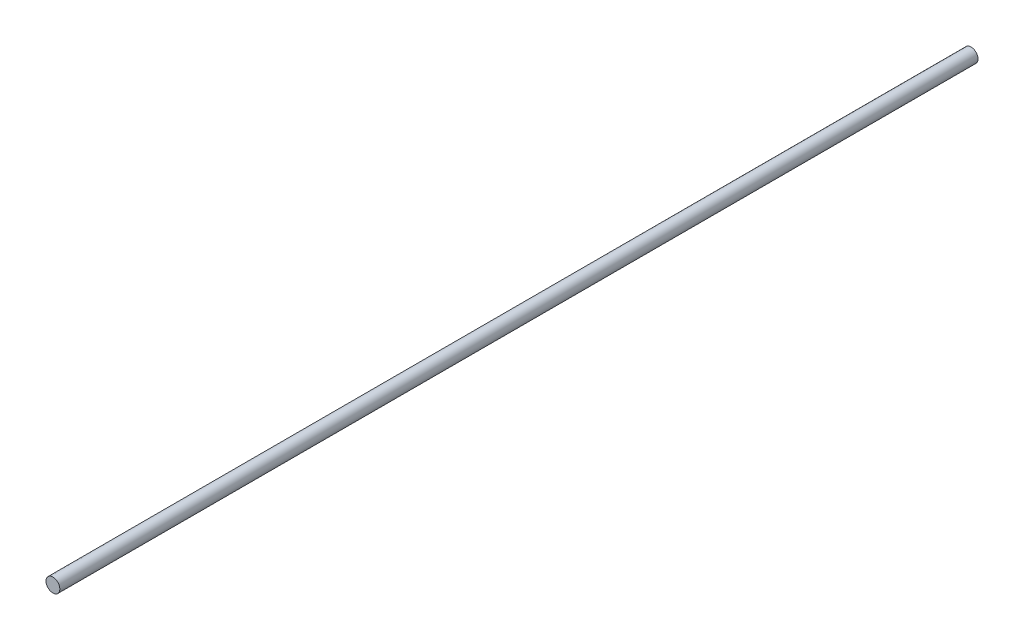
ISO-10303-21;
HEADER;
FILE_DESCRIPTION(('STEP AP214'),'2;1');
FILE_NAME('part.step','',(''),(''),'','','');
FILE_SCHEMA(('AUTOMOTIVE_DESIGN { 1 0 10303 214 1 1 1 1 }'));
ENDSEC;
DATA;
#1=APPLICATION_CONTEXT('core data for automotive mechanical design processes');
#2=APPLICATION_PROTOCOL_DEFINITION('international standard','automotive_design',2000,#1);
#3=PRODUCT_CONTEXT('',#1,'mechanical');
#4=PRODUCT('Part','Part','',(#3));
#5=PRODUCT_RELATED_PRODUCT_CATEGORY('part','',(#4));
#6=PRODUCT_DEFINITION_FORMATION('','',#4);
#7=PRODUCT_DEFINITION_CONTEXT('part definition',#1,'design');
#8=PRODUCT_DEFINITION('design','',#6,#7);
#9=PRODUCT_DEFINITION_SHAPE('','',#8);
#10=(LENGTH_UNIT() NAMED_UNIT(*) SI_UNIT(.MILLI.,.METRE.));
#11=(NAMED_UNIT(*) PLANE_ANGLE_UNIT() SI_UNIT($,.RADIAN.));
#12=(NAMED_UNIT(*) SI_UNIT($,.STERADIAN.) SOLID_ANGLE_UNIT());
#13=UNCERTAINTY_MEASURE_WITH_UNIT(LENGTH_MEASURE(1.E-05),#10,'distance_accuracy_value','');
#14=(GEOMETRIC_REPRESENTATION_CONTEXT(3) GLOBAL_UNCERTAINTY_ASSIGNED_CONTEXT((#13)) GLOBAL_UNIT_ASSIGNED_CONTEXT((#10,
#11,#12)) REPRESENTATION_CONTEXT('',''));
#15=CARTESIAN_POINT('',(0.,0.,0.));
#16=DIRECTION('',(0.,0.,1.));
#17=DIRECTION('',(1.,0.,0.));
#18=AXIS2_PLACEMENT_3D('',#15,#16,#17);
#19=CARTESIAN_POINT('',(0.,0.,914.4));
#20=DIRECTION('',(0.,0.,-1.));
#21=DIRECTION('',(-1.,0.,0.));
#22=AXIS2_PLACEMENT_3D('',#19,#20,#21);
#23=CYLINDRICAL_SURFACE('',#22,6.35);
#24=CARTESIAN_POINT('',(0.,0.,38.1));
#25=DIRECTION('',(0.,0.,1.));
#26=DIRECTION('',(1.,0.,0.));
#27=AXIS2_PLACEMENT_3D('',#24,#25,#26);
#28=CIRCLE('',#27,6.35);
#29=CARTESIAN_POINT('',(6.35,0.,38.1));
#30=VERTEX_POINT('',#29);
#31=EDGE_CURVE('E10',#30,#30,#28,.T.);
#32=ORIENTED_EDGE('',*,*,#31,.T.);
#33=EDGE_LOOP('',(#32));
#34=FACE_BOUND('',#33,.T.);
#35=CARTESIAN_POINT('',(0.,0.,880.11));
#36=DIRECTION('',(0.,0.,1.));
#37=DIRECTION('',(1.,0.,0.));
#38=AXIS2_PLACEMENT_3D('',#35,#36,#37);
#39=CIRCLE('',#38,6.35);
#40=CARTESIAN_POINT('',(6.35,0.,880.11));
#41=VERTEX_POINT('',#40);
#42=EDGE_CURVE('E36',#41,#41,#39,.T.);
#43=ORIENTED_EDGE('',*,*,#42,.F.);
#44=EDGE_LOOP('',(#43));
#45=FACE_BOUND('',#44,.T.);
#46=ADVANCED_FACE('F30',(#34,#45),#23,.T.);
#47=CARTESIAN_POINT('',(0.,0.,880.11));
#48=DIRECTION('',(0.,0.,1.));
#49=DIRECTION('',(1.,0.,0.));
#50=AXIS2_PLACEMENT_3D('',#47,#48,#49);
#51=PLANE('',#50);
#52=ORIENTED_EDGE('',*,*,#42,.T.);
#53=EDGE_LOOP('',(#52));
#54=FACE_BOUND('',#53,.T.);
#55=ADVANCED_FACE('F42',(#54),#51,.T.);
#56=CARTESIAN_POINT('',(-6.35,-6.35,38.1));
#57=DIRECTION('',(0.,0.,1.));
#58=DIRECTION('',(1.,0.,0.));
#59=AXIS2_PLACEMENT_3D('',#56,#57,#58);
#60=PLANE('',#59);
#61=ORIENTED_EDGE('',*,*,#31,.F.);
#62=EDGE_LOOP('',(#61));
#63=FACE_BOUND('',#62,.T.);
#64=ADVANCED_FACE('F48',(#63),#60,.F.);
#65=CLOSED_SHELL('',(#46,#55,#64));
#66=MANIFOLD_SOLID_BREP('B2',#65);
#67=ADVANCED_BREP_SHAPE_REPRESENTATION('',(#18,#66),#14);
#68=SHAPE_DEFINITION_REPRESENTATION(#9,#67);
ENDSEC;
END-ISO-10303-21;
